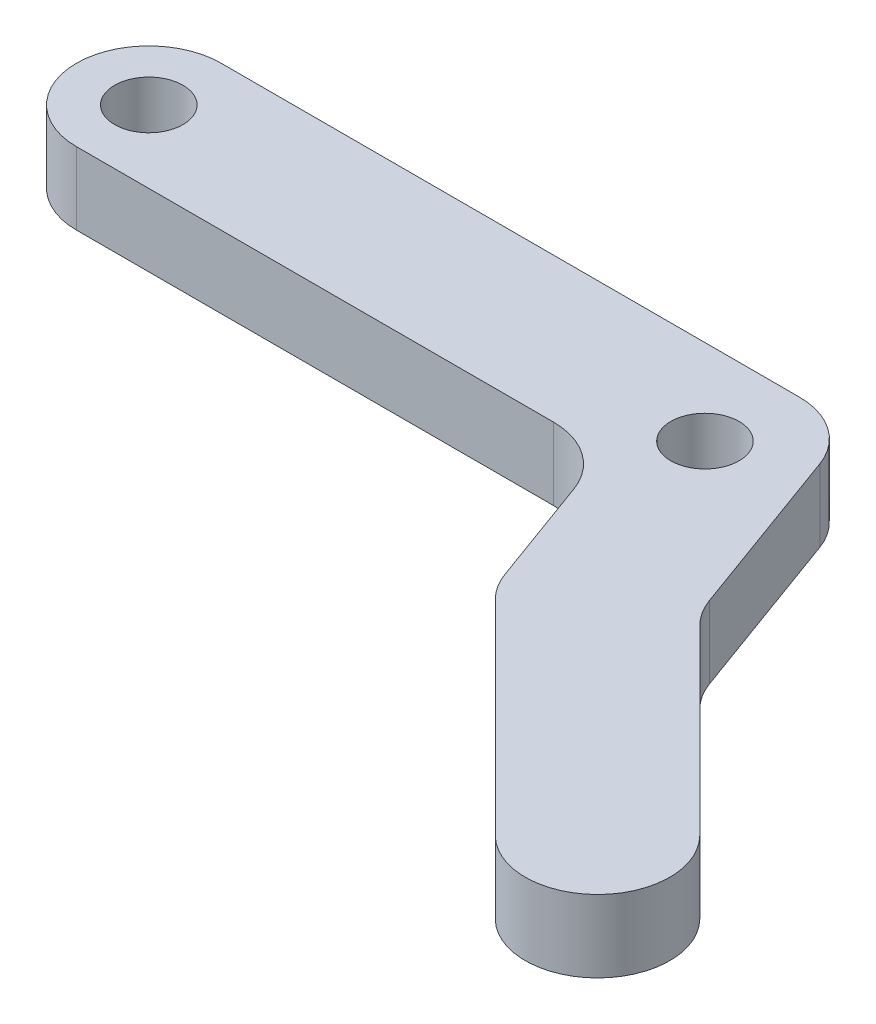
ISO-10303-21;
HEADER;
FILE_DESCRIPTION(('STEP AP214'),'2;1');
FILE_NAME('part.step','',(''),(''),'','','');
FILE_SCHEMA(('AUTOMOTIVE_DESIGN { 1 0 10303 214 1 1 1 1 }'));
ENDSEC;
DATA;
#1=APPLICATION_CONTEXT('core data for automotive mechanical design processes');
#2=APPLICATION_PROTOCOL_DEFINITION('international standard','automotive_design',2000,#1);
#3=PRODUCT_CONTEXT('',#1,'mechanical');
#4=PRODUCT('Part','Part','',(#3));
#5=PRODUCT_RELATED_PRODUCT_CATEGORY('part','',(#4));
#6=PRODUCT_DEFINITION_FORMATION('','',#4);
#7=PRODUCT_DEFINITION_CONTEXT('part definition',#1,'design');
#8=PRODUCT_DEFINITION('design','',#6,#7);
#9=PRODUCT_DEFINITION_SHAPE('','',#8);
#10=(LENGTH_UNIT() NAMED_UNIT(*) SI_UNIT(.MILLI.,.METRE.));
#11=(NAMED_UNIT(*) PLANE_ANGLE_UNIT() SI_UNIT($,.RADIAN.));
#12=(NAMED_UNIT(*) SI_UNIT($,.STERADIAN.) SOLID_ANGLE_UNIT());
#13=UNCERTAINTY_MEASURE_WITH_UNIT(LENGTH_MEASURE(1.E-05),#10,'distance_accuracy_value','');
#14=(GEOMETRIC_REPRESENTATION_CONTEXT(3) GLOBAL_UNCERTAINTY_ASSIGNED_CONTEXT((#13)) GLOBAL_UNIT_ASSIGNED_CONTEXT((#10,
#11,#12)) REPRESENTATION_CONTEXT('',''));
#15=CARTESIAN_POINT('',(0.,0.,0.));
#16=DIRECTION('',(0.,0.,1.));
#17=DIRECTION('',(1.,0.,0.));
#18=AXIS2_PLACEMENT_3D('',#15,#16,#17);
#19=CARTESIAN_POINT('',(0.,3.175,0.));
#20=DIRECTION('',(0.,-1.,0.));
#21=DIRECTION('',(0.,0.,-1.));
#22=AXIS2_PLACEMENT_3D('',#19,#20,#21);
#23=PLANE('',#22);
#24=CARTESIAN_POINT('',(0.,3.175,0.));
#25=DIRECTION('',(0.,1.,0.));
#26=DIRECTION('',(0.,0.,-1.));
#27=AXIS2_PLACEMENT_3D('',#24,#25,#26);
#28=CIRCLE('',#27,3.175);
#29=CARTESIAN_POINT('',(0.,3.175,-3.175));
#30=VERTEX_POINT('',#29);
#31=CARTESIAN_POINT('',(0.,3.175,3.175));
#32=VERTEX_POINT('',#31);
#33=EDGE_CURVE('E229',#30,#32,#28,.T.);
#34=ORIENTED_EDGE('',*,*,#33,.T.);
#35=DIRECTION('',(1.,0.,0.));
#36=VECTOR('',#35,1.);
#37=CARTESIAN_POINT('',(0.,3.175,3.175));
#38=LINE('',#37,#36);
#39=CARTESIAN_POINT('',(20.9536821323683,3.175,3.175));
#40=VERTEX_POINT('',#39);
#41=EDGE_CURVE('E133',#32,#40,#38,.T.);
#42=ORIENTED_EDGE('',*,*,#41,.T.);
#43=CARTESIAN_POINT('',(20.9536821323683,3.175,6.35));
#44=DIRECTION('',(0.,-1.,0.));
#45=DIRECTION('',(0.,0.,-1.));
#46=AXIS2_PLACEMENT_3D('',#43,#44,#45);
#47=CIRCLE('',#46,3.175);
#48=CARTESIAN_POINT('',(23.9372062033636,3.175,5.26408604494101));
#49=VERTEX_POINT('',#48);
#50=EDGE_CURVE('E267',#40,#49,#47,.T.);
#51=ORIENTED_EDGE('',*,*,#50,.T.);
#52=DIRECTION('',(0.342020143325664,0.,0.93969262078591));
#53=VECTOR('',#52,1.);
#54=CARTESIAN_POINT('',(23.9372062033636,3.175,5.26408604494101));
#55=LINE('',#54,#53);
#56=CARTESIAN_POINT('',(25.6742177941817,3.175,10.0364861680448));
#57=VERTEX_POINT('',#56);
#58=EDGE_CURVE('E289',#49,#57,#55,.T.);
#59=ORIENTED_EDGE('',*,*,#58,.T.);
#60=CARTESIAN_POINT('',(28.657741865177,3.175,8.95057221298579));
#61=DIRECTION('',(0.,1.,0.));
#62=DIRECTION('',(0.,0.,1.));
#63=AXIS2_PLACEMENT_3D('',#60,#61,#62);
#64=CIRCLE('',#63,3.175);
#65=CARTESIAN_POINT('',(26.4126778349097,3.175,11.1956362432531));
#66=VERTEX_POINT('',#65);
#67=EDGE_CURVE('E284',#57,#66,#64,.T.);
#68=ORIENTED_EDGE('',*,*,#67,.T.);
#69=DIRECTION('',(0.707106781186547,0.,0.707106781186548));
#70=VECTOR('',#69,1.);
#71=CARTESIAN_POINT('',(35.3929339559788,3.175,20.1758923643222));
#72=LINE('',#71,#70);
#73=CARTESIAN_POINT('',(35.3929339559788,3.175,20.1758923643222));
#74=VERTEX_POINT('',#73);
#75=EDGE_CURVE('E286',#66,#74,#72,.T.);
#76=ORIENTED_EDGE('',*,*,#75,.T.);
#77=CARTESIAN_POINT('',(37.6379979862461,3.175,17.930828334055));
#78=DIRECTION('',(0.,1.,0.));
#79=DIRECTION('',(0.,0.,-1.));
#80=AXIS2_PLACEMENT_3D('',#77,#78,#79);
#81=CIRCLE('',#80,3.17499999999999);
#82=CARTESIAN_POINT('',(39.8830620165134,3.175,15.6857643037877));
#83=VERTEX_POINT('',#82);
#84=EDGE_CURVE('E291',#74,#83,#81,.T.);
#85=ORIENTED_EDGE('',*,*,#84,.T.);
#86=DIRECTION('',(-0.707106781186546,0.,-0.707106781186549));
#87=VECTOR('',#86,1.);
#88=CARTESIAN_POINT('',(31.8982433210481,3.175,7.70094560832232));
#89=LINE('',#88,#87);
#90=CARTESIAN_POINT('',(31.8982433210481,3.175,7.70094560832232));
#91=VERTEX_POINT('',#90);
#92=EDGE_CURVE('E303',#83,#91,#89,.T.);
#93=ORIENTED_EDGE('',*,*,#92,.T.);
#94=CARTESIAN_POINT('',(34.1433073513154,3.175,5.45588157805504));
#95=DIRECTION('',(0.,-1.,0.));
#96=DIRECTION('',(0.,0.,1.));
#97=AXIS2_PLACEMENT_3D('',#94,#95,#96);
#98=CIRCLE('',#97,3.175);
#99=CARTESIAN_POINT('',(31.1597832803201,3.175,6.54179553311403));
#100=VERTEX_POINT('',#99);
#101=EDGE_CURVE('E172',#91,#100,#98,.T.);
#102=ORIENTED_EDGE('',*,*,#101,.T.);
#103=DIRECTION('',(-0.342020143325666,0.,-0.939692620785909));
#104=VECTOR('',#103,1.);
#105=CARTESIAN_POINT('',(28.3835240709953,3.175,-1.08591395505899));
#106=LINE('',#105,#104);
#107=CARTESIAN_POINT('',(28.3835240709953,3.175,-1.08591395505899));
#108=VERTEX_POINT('',#107);
#109=EDGE_CURVE('E170',#100,#108,#106,.T.);
#110=ORIENTED_EDGE('',*,*,#109,.T.);
#111=CARTESIAN_POINT('',(25.4,3.175,0.));
#112=DIRECTION('',(0.,1.,0.));
#113=DIRECTION('',(0.,0.,-1.));
#114=AXIS2_PLACEMENT_3D('',#111,#112,#113);
#115=CIRCLE('',#114,3.175);
#116=CARTESIAN_POINT('',(25.4,3.175,-3.175));
#117=VERTEX_POINT('',#116);
#118=EDGE_CURVE('E171',#108,#117,#115,.T.);
#119=ORIENTED_EDGE('',*,*,#118,.T.);
#120=DIRECTION('',(-1.,0.,0.));
#121=VECTOR('',#120,1.);
#122=CARTESIAN_POINT('',(0.,3.175,-3.175));
#123=LINE('',#122,#121);
#124=EDGE_CURVE('E68',#117,#30,#123,.T.);
#125=ORIENTED_EDGE('',*,*,#124,.T.);
#126=EDGE_LOOP('',(#34,#42,#51,#59,#68,#76,#85,#93,#102,#110,#119,#125));
#127=FACE_BOUND('',#126,.T.);
#128=CARTESIAN_POINT('',(24.9979462515987,3.175,0.574192259382452));
#129=DIRECTION('',(0.,1.,0.));
#130=DIRECTION('',(0.,0.,1.));
#131=AXIS2_PLACEMENT_3D('',#128,#129,#130);
#132=CIRCLE('',#131,1.5);
#133=CARTESIAN_POINT('',(24.9979462515987,3.175,2.07419225938245));
#134=VERTEX_POINT('',#133);
#135=EDGE_CURVE('E203',#134,#134,#132,.T.);
#136=ORIENTED_EDGE('',*,*,#135,.F.);
#137=EDGE_LOOP('',(#136));
#138=FACE_BOUND('',#137,.T.);
#139=CARTESIAN_POINT('',(0.,3.175,0.));
#140=DIRECTION('',(0.,1.,0.));
#141=DIRECTION('',(0.,0.,1.));
#142=AXIS2_PLACEMENT_3D('',#139,#140,#141);
#143=CIRCLE('',#142,1.5);
#144=CARTESIAN_POINT('',(0.,3.175,1.5));
#145=VERTEX_POINT('',#144);
#146=EDGE_CURVE('E308',#145,#145,#143,.T.);
#147=ORIENTED_EDGE('',*,*,#146,.F.);
#148=EDGE_LOOP('',(#147));
#149=FACE_BOUND('',#148,.T.);
#150=ADVANCED_FACE('F44',(#127,#138,#149),#23,.F.);
#151=CARTESIAN_POINT('',(0.,0.,0.));
#152=DIRECTION('',(0.,-1.,0.));
#153=DIRECTION('',(0.,0.,-1.));
#154=AXIS2_PLACEMENT_3D('',#151,#152,#153);
#155=PLANE('',#154);
#156=CARTESIAN_POINT('',(24.9979462515987,0.,0.574192259382452));
#157=DIRECTION('',(0.,1.,0.));
#158=DIRECTION('',(0.,0.,1.));
#159=AXIS2_PLACEMENT_3D('',#156,#157,#158);
#160=CIRCLE('',#159,1.5);
#161=CARTESIAN_POINT('',(24.9979462515987,0.,2.07419225938245));
#162=VERTEX_POINT('',#161);
#163=EDGE_CURVE('E304',#162,#162,#160,.T.);
#164=ORIENTED_EDGE('',*,*,#163,.T.);
#165=EDGE_LOOP('',(#164));
#166=FACE_BOUND('',#165,.T.);
#167=CARTESIAN_POINT('',(0.,0.,0.));
#168=DIRECTION('',(0.,1.,0.));
#169=DIRECTION('',(0.,0.,-1.));
#170=AXIS2_PLACEMENT_3D('',#167,#168,#169);
#171=CIRCLE('',#170,3.175);
#172=CARTESIAN_POINT('',(0.,0.,-3.175));
#173=VERTEX_POINT('',#172);
#174=CARTESIAN_POINT('',(0.,0.,3.175));
#175=VERTEX_POINT('',#174);
#176=EDGE_CURVE('E198',#173,#175,#171,.T.);
#177=ORIENTED_EDGE('',*,*,#176,.F.);
#178=DIRECTION('',(-1.,0.,0.));
#179=VECTOR('',#178,1.);
#180=CARTESIAN_POINT('',(0.,0.,-3.175));
#181=LINE('',#180,#179);
#182=CARTESIAN_POINT('',(25.4,0.,-3.175));
#183=VERTEX_POINT('',#182);
#184=EDGE_CURVE('E122',#183,#173,#181,.T.);
#185=ORIENTED_EDGE('',*,*,#184,.F.);
#186=CARTESIAN_POINT('',(25.4,0.,0.));
#187=DIRECTION('',(0.,1.,0.));
#188=DIRECTION('',(0.,0.,-1.));
#189=AXIS2_PLACEMENT_3D('',#186,#187,#188);
#190=CIRCLE('',#189,3.175);
#191=CARTESIAN_POINT('',(28.3835240709953,0.,-1.08591395505899));
#192=VERTEX_POINT('',#191);
#193=EDGE_CURVE('E118',#192,#183,#190,.T.);
#194=ORIENTED_EDGE('',*,*,#193,.F.);
#195=DIRECTION('',(-0.342020143325666,0.,-0.939692620785909));
#196=VECTOR('',#195,1.);
#197=CARTESIAN_POINT('',(28.3835240709953,0.,-1.08591395505899));
#198=LINE('',#197,#196);
#199=CARTESIAN_POINT('',(31.1597832803201,0.,6.54179553311403));
#200=VERTEX_POINT('',#199);
#201=EDGE_CURVE('E185',#200,#192,#198,.T.);
#202=ORIENTED_EDGE('',*,*,#201,.F.);
#203=CARTESIAN_POINT('',(34.1433073513154,0.,5.45588157805504));
#204=DIRECTION('',(0.,-1.,0.));
#205=DIRECTION('',(0.,0.,1.));
#206=AXIS2_PLACEMENT_3D('',#203,#204,#205);
#207=CIRCLE('',#206,3.175);
#208=CARTESIAN_POINT('',(31.8982433210481,0.,7.70094560832232));
#209=VERTEX_POINT('',#208);
#210=EDGE_CURVE('E222',#209,#200,#207,.T.);
#211=ORIENTED_EDGE('',*,*,#210,.F.);
#212=DIRECTION('',(-0.707106781186546,0.,-0.707106781186549));
#213=VECTOR('',#212,1.);
#214=CARTESIAN_POINT('',(31.8982433210481,0.,7.70094560832232));
#215=LINE('',#214,#213);
#216=CARTESIAN_POINT('',(39.8830620165134,0.,15.6857643037877));
#217=VERTEX_POINT('',#216);
#218=EDGE_CURVE('E217',#217,#209,#215,.T.);
#219=ORIENTED_EDGE('',*,*,#218,.F.);
#220=CARTESIAN_POINT('',(37.6379979862461,0.,17.930828334055));
#221=DIRECTION('',(0.,1.,0.));
#222=DIRECTION('',(0.,0.,-1.));
#223=AXIS2_PLACEMENT_3D('',#220,#221,#222);
#224=CIRCLE('',#223,3.17499999999999);
#225=CARTESIAN_POINT('',(35.3929339559788,0.,20.1758923643222));
#226=VERTEX_POINT('',#225);
#227=EDGE_CURVE('E214',#226,#217,#224,.T.);
#228=ORIENTED_EDGE('',*,*,#227,.F.);
#229=DIRECTION('',(0.707106781186547,0.,0.707106781186548));
#230=VECTOR('',#229,1.);
#231=CARTESIAN_POINT('',(35.3929339559788,0.,20.1758923643222));
#232=LINE('',#231,#230);
#233=CARTESIAN_POINT('',(26.4126778349097,0.,11.1956362432531));
#234=VERTEX_POINT('',#233);
#235=EDGE_CURVE('E215',#234,#226,#232,.T.);
#236=ORIENTED_EDGE('',*,*,#235,.F.);
#237=CARTESIAN_POINT('',(28.657741865177,0.,8.95057221298579));
#238=DIRECTION('',(0.,1.,0.));
#239=DIRECTION('',(0.,0.,1.));
#240=AXIS2_PLACEMENT_3D('',#237,#238,#239);
#241=CIRCLE('',#240,3.175);
#242=CARTESIAN_POINT('',(25.6742177941817,0.,10.0364861680448));
#243=VERTEX_POINT('',#242);
#244=EDGE_CURVE('E207',#243,#234,#241,.T.);
#245=ORIENTED_EDGE('',*,*,#244,.F.);
#246=DIRECTION('',(0.342020143325664,0.,0.93969262078591));
#247=VECTOR('',#246,1.);
#248=CARTESIAN_POINT('',(23.9372062033636,0.,5.26408604494101));
#249=LINE('',#248,#247);
#250=CARTESIAN_POINT('',(23.9372062033636,0.,5.26408604494101));
#251=VERTEX_POINT('',#250);
#252=EDGE_CURVE('E206',#251,#243,#249,.T.);
#253=ORIENTED_EDGE('',*,*,#252,.F.);
#254=CARTESIAN_POINT('',(20.9536821323683,0.,6.35));
#255=DIRECTION('',(0.,-1.,0.));
#256=DIRECTION('',(0.,0.,-1.));
#257=AXIS2_PLACEMENT_3D('',#254,#255,#256);
#258=CIRCLE('',#257,3.175);
#259=CARTESIAN_POINT('',(20.9536821323683,0.,3.175));
#260=VERTEX_POINT('',#259);
#261=EDGE_CURVE('E204',#260,#251,#258,.T.);
#262=ORIENTED_EDGE('',*,*,#261,.F.);
#263=DIRECTION('',(1.,0.,0.));
#264=VECTOR('',#263,1.);
#265=CARTESIAN_POINT('',(0.,0.,3.175));
#266=LINE('',#265,#264);
#267=EDGE_CURVE('E199',#175,#260,#266,.T.);
#268=ORIENTED_EDGE('',*,*,#267,.F.);
#269=EDGE_LOOP('',(#177,#185,#194,#202,#211,#219,#228,#236,#245,#253,#262,#268));
#270=FACE_BOUND('',#269,.T.);
#271=CARTESIAN_POINT('',(0.,0.,0.));
#272=DIRECTION('',(0.,1.,0.));
#273=DIRECTION('',(0.,0.,1.));
#274=AXIS2_PLACEMENT_3D('',#271,#272,#273);
#275=CIRCLE('',#274,1.5);
#276=CARTESIAN_POINT('',(0.,0.,1.5));
#277=VERTEX_POINT('',#276);
#278=EDGE_CURVE('E312',#277,#277,#275,.T.);
#279=ORIENTED_EDGE('',*,*,#278,.T.);
#280=EDGE_LOOP('',(#279));
#281=FACE_BOUND('',#280,.T.);
#282=ADVANCED_FACE('F272',(#166,#270,#281),#155,.T.);
#283=CARTESIAN_POINT('',(0.,3.175,0.));
#284=DIRECTION('',(0.,-1.,0.));
#285=DIRECTION('',(0.,0.,-1.));
#286=AXIS2_PLACEMENT_3D('',#283,#284,#285);
#287=CYLINDRICAL_SURFACE('',#286,3.175);
#288=ORIENTED_EDGE('',*,*,#176,.T.);
#289=DIRECTION('',(0.,-1.,0.));
#290=VECTOR('',#289,1.);
#291=CARTESIAN_POINT('',(0.,3.175,3.175));
#292=LINE('',#291,#290);
#293=EDGE_CURVE('E11',#32,#175,#292,.T.);
#294=ORIENTED_EDGE('',*,*,#293,.F.);
#295=ORIENTED_EDGE('',*,*,#33,.F.);
#296=DIRECTION('',(0.,-1.,0.));
#297=VECTOR('',#296,1.);
#298=CARTESIAN_POINT('',(0.,3.175,-3.175));
#299=LINE('',#298,#297);
#300=EDGE_CURVE('E195',#30,#173,#299,.T.);
#301=ORIENTED_EDGE('',*,*,#300,.T.);
#302=EDGE_LOOP('',(#288,#294,#295,#301));
#303=FACE_BOUND('',#302,.T.);
#304=ADVANCED_FACE('F50',(#303),#287,.T.);
#305=CARTESIAN_POINT('',(0.,3.175,3.175));
#306=DIRECTION('',(0.,0.,-1.));
#307=DIRECTION('',(-1.,0.,0.));
#308=AXIS2_PLACEMENT_3D('',#305,#306,#307);
#309=PLANE('',#308);
#310=ORIENTED_EDGE('',*,*,#267,.T.);
#311=DIRECTION('',(0.,-1.,0.));
#312=VECTOR('',#311,1.);
#313=CARTESIAN_POINT('',(20.9536821323683,3.175,3.175));
#314=LINE('',#313,#312);
#315=EDGE_CURVE('E54',#40,#260,#314,.T.);
#316=ORIENTED_EDGE('',*,*,#315,.F.);
#317=ORIENTED_EDGE('',*,*,#41,.F.);
#318=ORIENTED_EDGE('',*,*,#293,.T.);
#319=EDGE_LOOP('',(#310,#316,#317,#318));
#320=FACE_BOUND('',#319,.T.);
#321=ADVANCED_FACE('F324',(#320),#309,.F.);
#322=CARTESIAN_POINT('',(20.9536821323683,3.175,6.35));
#323=DIRECTION('',(0.,-1.,0.));
#324=DIRECTION('',(0.,0.,-1.));
#325=AXIS2_PLACEMENT_3D('',#322,#323,#324);
#326=CYLINDRICAL_SURFACE('',#325,3.175);
#327=ORIENTED_EDGE('',*,*,#261,.T.);
#328=DIRECTION('',(0.,-1.,0.));
#329=VECTOR('',#328,1.);
#330=CARTESIAN_POINT('',(23.9372062033636,3.175,5.26408604494101));
#331=LINE('',#330,#329);
#332=EDGE_CURVE('E260',#49,#251,#331,.T.);
#333=ORIENTED_EDGE('',*,*,#332,.F.);
#334=ORIENTED_EDGE('',*,*,#50,.F.);
#335=ORIENTED_EDGE('',*,*,#315,.T.);
#336=EDGE_LOOP('',(#327,#333,#334,#335));
#337=FACE_BOUND('',#336,.T.);
#338=ADVANCED_FACE('F270',(#337),#326,.F.);
#339=CARTESIAN_POINT('',(23.9372062033636,3.175,5.26408604494101));
#340=DIRECTION('',(0.93969262078591,0.,-0.342020143325664));
#341=DIRECTION('',(-0.342020143325664,0.,-0.93969262078591));
#342=AXIS2_PLACEMENT_3D('',#339,#340,#341);
#343=PLANE('',#342);
#344=ORIENTED_EDGE('',*,*,#252,.T.);
#345=DIRECTION('',(0.,-1.,0.));
#346=VECTOR('',#345,1.);
#347=CARTESIAN_POINT('',(25.6742177941817,3.175,10.0364861680448));
#348=LINE('',#347,#346);
#349=EDGE_CURVE('E251',#57,#243,#348,.T.);
#350=ORIENTED_EDGE('',*,*,#349,.F.);
#351=ORIENTED_EDGE('',*,*,#58,.F.);
#352=ORIENTED_EDGE('',*,*,#332,.T.);
#353=EDGE_LOOP('',(#344,#350,#351,#352));
#354=FACE_BOUND('',#353,.T.);
#355=ADVANCED_FACE('F276',(#354),#343,.F.);
#356=CARTESIAN_POINT('',(28.657741865177,3.175,8.95057221298579));
#357=DIRECTION('',(0.,-1.,0.));
#358=DIRECTION('',(0.,0.,-1.));
#359=AXIS2_PLACEMENT_3D('',#356,#357,#358);
#360=CYLINDRICAL_SURFACE('',#359,3.175);
#361=ORIENTED_EDGE('',*,*,#244,.T.);
#362=DIRECTION('',(0.,-1.,0.));
#363=VECTOR('',#362,1.);
#364=CARTESIAN_POINT('',(26.4126778349097,3.175,11.1956362432531));
#365=LINE('',#364,#363);
#366=EDGE_CURVE('E249',#66,#234,#365,.T.);
#367=ORIENTED_EDGE('',*,*,#366,.F.);
#368=ORIENTED_EDGE('',*,*,#67,.F.);
#369=ORIENTED_EDGE('',*,*,#349,.T.);
#370=EDGE_LOOP('',(#361,#367,#368,#369));
#371=FACE_BOUND('',#370,.T.);
#372=ADVANCED_FACE('F282',(#371),#360,.T.);
#373=CARTESIAN_POINT('',(35.3929339559788,3.175,20.1758923643222));
#374=DIRECTION('',(0.707106781186548,0.,-0.707106781186547));
#375=DIRECTION('',(-0.707106781186547,0.,-0.707106781186548));
#376=AXIS2_PLACEMENT_3D('',#373,#374,#375);
#377=PLANE('',#376);
#378=ORIENTED_EDGE('',*,*,#235,.T.);
#379=DIRECTION('',(0.,-1.,0.));
#380=VECTOR('',#379,1.);
#381=CARTESIAN_POINT('',(35.3929339559788,3.175,20.1758923643222));
#382=LINE('',#381,#380);
#383=EDGE_CURVE('E244',#74,#226,#382,.T.);
#384=ORIENTED_EDGE('',*,*,#383,.F.);
#385=ORIENTED_EDGE('',*,*,#75,.F.);
#386=ORIENTED_EDGE('',*,*,#366,.T.);
#387=EDGE_LOOP('',(#378,#384,#385,#386));
#388=FACE_BOUND('',#387,.T.);
#389=ADVANCED_FACE('F356',(#388),#377,.F.);
#390=CARTESIAN_POINT('',(37.6379979862461,3.175,17.930828334055));
#391=DIRECTION('',(0.,-1.,0.));
#392=DIRECTION('',(0.,0.,-1.));
#393=AXIS2_PLACEMENT_3D('',#390,#391,#392);
#394=CYLINDRICAL_SURFACE('',#393,3.17499999999999);
#395=ORIENTED_EDGE('',*,*,#227,.T.);
#396=DIRECTION('',(0.,-1.,0.));
#397=VECTOR('',#396,1.);
#398=CARTESIAN_POINT('',(39.8830620165134,3.175,15.6857643037877));
#399=LINE('',#398,#397);
#400=EDGE_CURVE('E241',#83,#217,#399,.T.);
#401=ORIENTED_EDGE('',*,*,#400,.F.);
#402=ORIENTED_EDGE('',*,*,#84,.F.);
#403=ORIENTED_EDGE('',*,*,#383,.T.);
#404=EDGE_LOOP('',(#395,#401,#402,#403));
#405=FACE_BOUND('',#404,.T.);
#406=ADVANCED_FACE('F353',(#405),#394,.T.);
#407=CARTESIAN_POINT('',(31.8982433210481,3.175,7.70094560832232));
#408=DIRECTION('',(-0.707106781186549,0.,0.707106781186546));
#409=DIRECTION('',(0.707106781186546,0.,0.707106781186549));
#410=AXIS2_PLACEMENT_3D('',#407,#408,#409);
#411=PLANE('',#410);
#412=ORIENTED_EDGE('',*,*,#218,.T.);
#413=DIRECTION('',(0.,-1.,0.));
#414=VECTOR('',#413,1.);
#415=CARTESIAN_POINT('',(31.8982433210481,3.175,7.70094560832232));
#416=LINE('',#415,#414);
#417=EDGE_CURVE('E240',#91,#209,#416,.T.);
#418=ORIENTED_EDGE('',*,*,#417,.F.);
#419=ORIENTED_EDGE('',*,*,#92,.F.);
#420=ORIENTED_EDGE('',*,*,#400,.T.);
#421=EDGE_LOOP('',(#412,#418,#419,#420));
#422=FACE_BOUND('',#421,.T.);
#423=ADVANCED_FACE('F348',(#422),#411,.F.);
#424=CARTESIAN_POINT('',(34.1433073513154,3.175,5.45588157805504));
#425=DIRECTION('',(0.,-1.,0.));
#426=DIRECTION('',(0.,0.,-1.));
#427=AXIS2_PLACEMENT_3D('',#424,#425,#426);
#428=CYLINDRICAL_SURFACE('',#427,3.175);
#429=ORIENTED_EDGE('',*,*,#210,.T.);
#430=DIRECTION('',(0.,-1.,0.));
#431=VECTOR('',#430,1.);
#432=CARTESIAN_POINT('',(31.1597832803201,3.175,6.54179553311403));
#433=LINE('',#432,#431);
#434=EDGE_CURVE('E184',#100,#200,#433,.T.);
#435=ORIENTED_EDGE('',*,*,#434,.F.);
#436=ORIENTED_EDGE('',*,*,#101,.F.);
#437=ORIENTED_EDGE('',*,*,#417,.T.);
#438=EDGE_LOOP('',(#429,#435,#436,#437));
#439=FACE_BOUND('',#438,.T.);
#440=ADVANCED_FACE('F346',(#439),#428,.F.);
#441=CARTESIAN_POINT('',(28.3835240709953,3.175,-1.08591395505899));
#442=DIRECTION('',(-0.939692620785909,0.,0.342020143325666));
#443=DIRECTION('',(0.342020143325666,0.,0.939692620785909));
#444=AXIS2_PLACEMENT_3D('',#441,#442,#443);
#445=PLANE('',#444);
#446=ORIENTED_EDGE('',*,*,#201,.T.);
#447=DIRECTION('',(0.,-1.,0.));
#448=VECTOR('',#447,1.);
#449=CARTESIAN_POINT('',(28.3835240709953,3.175,-1.08591395505899));
#450=LINE('',#449,#448);
#451=EDGE_CURVE('E179',#108,#192,#450,.T.);
#452=ORIENTED_EDGE('',*,*,#451,.F.);
#453=ORIENTED_EDGE('',*,*,#109,.F.);
#454=ORIENTED_EDGE('',*,*,#434,.T.);
#455=EDGE_LOOP('',(#446,#452,#453,#454));
#456=FACE_BOUND('',#455,.T.);
#457=ADVANCED_FACE('F177',(#456),#445,.F.);
#458=CARTESIAN_POINT('',(25.4,3.175,0.));
#459=DIRECTION('',(0.,-1.,0.));
#460=DIRECTION('',(0.,0.,-1.));
#461=AXIS2_PLACEMENT_3D('',#458,#459,#460);
#462=CYLINDRICAL_SURFACE('',#461,3.175);
#463=ORIENTED_EDGE('',*,*,#193,.T.);
#464=DIRECTION('',(0.,-1.,0.));
#465=VECTOR('',#464,1.);
#466=CARTESIAN_POINT('',(25.4,3.175,-3.175));
#467=LINE('',#466,#465);
#468=EDGE_CURVE('E183',#117,#183,#467,.T.);
#469=ORIENTED_EDGE('',*,*,#468,.F.);
#470=ORIENTED_EDGE('',*,*,#118,.F.);
#471=ORIENTED_EDGE('',*,*,#451,.T.);
#472=EDGE_LOOP('',(#463,#469,#470,#471));
#473=FACE_BOUND('',#472,.T.);
#474=ADVANCED_FACE('F190',(#473),#462,.T.);
#475=CARTESIAN_POINT('',(0.,3.175,-3.175));
#476=DIRECTION('',(0.,0.,1.));
#477=DIRECTION('',(1.,0.,0.));
#478=AXIS2_PLACEMENT_3D('',#475,#476,#477);
#479=PLANE('',#478);
#480=ORIENTED_EDGE('',*,*,#184,.T.);
#481=ORIENTED_EDGE('',*,*,#300,.F.);
#482=ORIENTED_EDGE('',*,*,#124,.F.);
#483=ORIENTED_EDGE('',*,*,#468,.T.);
#484=EDGE_LOOP('',(#480,#481,#482,#483));
#485=FACE_BOUND('',#484,.T.);
#486=ADVANCED_FACE('F345',(#485),#479,.F.);
#487=CARTESIAN_POINT('',(24.9979462515987,3.175,0.574192259382452));
#488=DIRECTION('',(0.,-1.,0.));
#489=DIRECTION('',(0.,0.,-1.));
#490=AXIS2_PLACEMENT_3D('',#487,#488,#489);
#491=CYLINDRICAL_SURFACE('',#490,1.5);
#492=ORIENTED_EDGE('',*,*,#135,.T.);
#493=EDGE_LOOP('',(#492));
#494=FACE_BOUND('',#493,.T.);
#495=ORIENTED_EDGE('',*,*,#163,.F.);
#496=EDGE_LOOP('',(#495));
#497=FACE_BOUND('',#496,.T.);
#498=ADVANCED_FACE('F338',(#494,#497),#491,.F.);
#499=CARTESIAN_POINT('',(0.,3.175,0.));
#500=DIRECTION('',(0.,-1.,0.));
#501=DIRECTION('',(0.,0.,-1.));
#502=AXIS2_PLACEMENT_3D('',#499,#500,#501);
#503=CYLINDRICAL_SURFACE('',#502,1.5);
#504=ORIENTED_EDGE('',*,*,#146,.T.);
#505=EDGE_LOOP('',(#504));
#506=FACE_BOUND('',#505,.T.);
#507=ORIENTED_EDGE('',*,*,#278,.F.);
#508=EDGE_LOOP('',(#507));
#509=FACE_BOUND('',#508,.T.);
#510=ADVANCED_FACE('F380',(#506,#509),#503,.F.);
#511=CLOSED_SHELL('',(#150,#282,#304,#321,#338,#355,#372,#389,#406,#423,#440,#457,#474,#486,
#498,#510));
#512=MANIFOLD_SOLID_BREP('B2',#511);
#513=ADVANCED_BREP_SHAPE_REPRESENTATION('',(#18,#512),#14);
#514=SHAPE_DEFINITION_REPRESENTATION(#9,#513);
ENDSEC;
END-ISO-10303-21;
